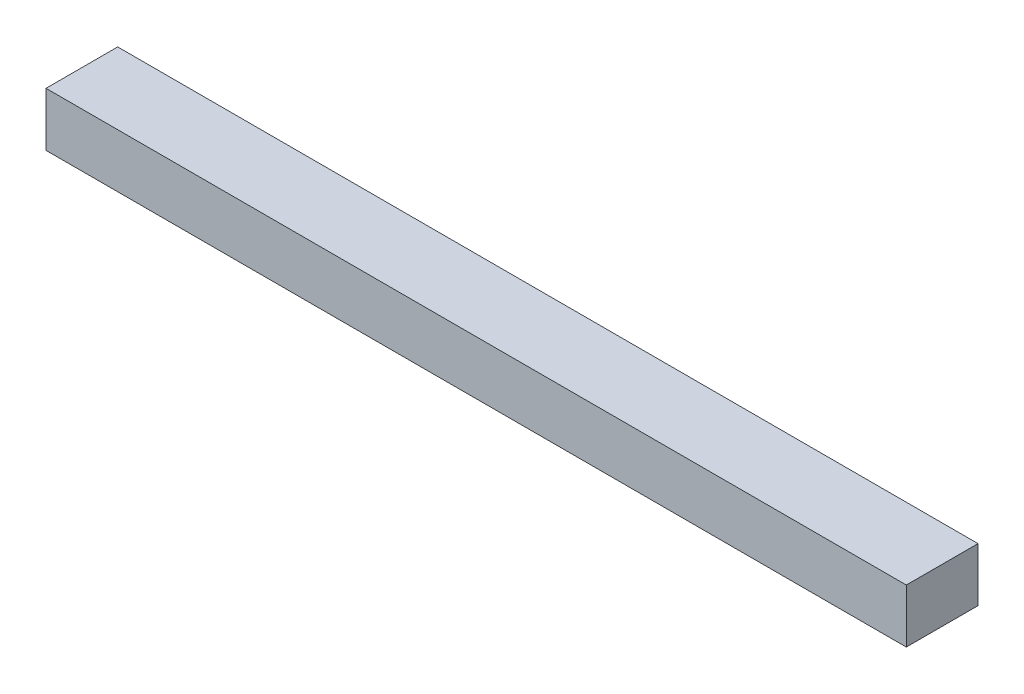
ISO-10303-21;
HEADER;
FILE_DESCRIPTION(('STEP AP214'),'2;1');
FILE_NAME('part.step','',(''),(''),'','','');
FILE_SCHEMA(('AUTOMOTIVE_DESIGN { 1 0 10303 214 1 1 1 1 }'));
ENDSEC;
DATA;
#1=APPLICATION_CONTEXT('core data for automotive mechanical design processes');
#2=APPLICATION_PROTOCOL_DEFINITION('international standard','automotive_design',2000,#1);
#3=PRODUCT_CONTEXT('',#1,'mechanical');
#4=PRODUCT('Part','Part','',(#3));
#5=PRODUCT_RELATED_PRODUCT_CATEGORY('part','',(#4));
#6=PRODUCT_DEFINITION_FORMATION('','',#4);
#7=PRODUCT_DEFINITION_CONTEXT('part definition',#1,'design');
#8=PRODUCT_DEFINITION('design','',#6,#7);
#9=PRODUCT_DEFINITION_SHAPE('','',#8);
#10=(LENGTH_UNIT() NAMED_UNIT(*) SI_UNIT(.MILLI.,.METRE.));
#11=(NAMED_UNIT(*) PLANE_ANGLE_UNIT() SI_UNIT($,.RADIAN.));
#12=(NAMED_UNIT(*) SI_UNIT($,.STERADIAN.) SOLID_ANGLE_UNIT());
#13=UNCERTAINTY_MEASURE_WITH_UNIT(LENGTH_MEASURE(1.E-05),#10,'distance_accuracy_value','');
#14=(GEOMETRIC_REPRESENTATION_CONTEXT(3) GLOBAL_UNCERTAINTY_ASSIGNED_CONTEXT((#13)) GLOBAL_UNIT_ASSIGNED_CONTEXT((#10,
#11,#12)) REPRESENTATION_CONTEXT('',''));
#15=CARTESIAN_POINT('',(0.,0.,0.));
#16=DIRECTION('',(0.,0.,1.));
#17=DIRECTION('',(1.,0.,0.));
#18=AXIS2_PLACEMENT_3D('',#15,#16,#17);
#19=CARTESIAN_POINT('',(-480.,70.,510.));
#20=DIRECTION('',(0.,0.,1.));
#21=DIRECTION('',(1.,0.,0.));
#22=AXIS2_PLACEMENT_3D('',#19,#20,#21);
#23=PLANE('',#22);
#24=DIRECTION('',(0.,1.,0.));
#25=VECTOR('',#24,1.);
#26=CARTESIAN_POINT('',(-480.,70.,510.));
#27=LINE('',#26,#25);
#28=CARTESIAN_POINT('',(-480.,70.,510.));
#29=VERTEX_POINT('',#28);
#30=CARTESIAN_POINT('',(-480.,130.,510.));
#31=VERTEX_POINT('',#30);
#32=EDGE_CURVE('E88',#29,#31,#27,.T.);
#33=ORIENTED_EDGE('',*,*,#32,.F.);
#34=DIRECTION('',(1.,0.,0.));
#35=VECTOR('',#34,1.);
#36=CARTESIAN_POINT('',(-480.,70.,510.));
#37=LINE('',#36,#35);
#38=CARTESIAN_POINT('',(480.,70.,510.));
#39=VERTEX_POINT('',#38);
#40=EDGE_CURVE('E69',#29,#39,#37,.T.);
#41=ORIENTED_EDGE('',*,*,#40,.T.);
#42=DIRECTION('',(0.,1.,0.));
#43=VECTOR('',#42,1.);
#44=CARTESIAN_POINT('',(480.,70.,510.));
#45=LINE('',#44,#43);
#46=CARTESIAN_POINT('',(480.,130.,510.));
#47=VERTEX_POINT('',#46);
#48=EDGE_CURVE('E81',#39,#47,#45,.T.);
#49=ORIENTED_EDGE('',*,*,#48,.T.);
#50=DIRECTION('',(1.,0.,0.));
#51=VECTOR('',#50,1.);
#52=CARTESIAN_POINT('',(-480.,130.,510.));
#53=LINE('',#52,#51);
#54=EDGE_CURVE('E9',#31,#47,#53,.T.);
#55=ORIENTED_EDGE('',*,*,#54,.F.);
#56=EDGE_LOOP('',(#33,#41,#49,#55));
#57=FACE_BOUND('',#56,.T.);
#58=ADVANCED_FACE('F15',(#57),#23,.T.);
#59=CARTESIAN_POINT('',(-480.,70.,430.));
#60=DIRECTION('',(0.,0.,1.));
#61=DIRECTION('',(1.,0.,0.));
#62=AXIS2_PLACEMENT_3D('',#59,#60,#61);
#63=PLANE('',#62);
#64=DIRECTION('',(1.,0.,0.));
#65=VECTOR('',#64,1.);
#66=CARTESIAN_POINT('',(-480.,130.,430.));
#67=LINE('',#66,#65);
#68=CARTESIAN_POINT('',(-480.,130.,430.));
#69=VERTEX_POINT('',#68);
#70=CARTESIAN_POINT('',(480.,130.,430.));
#71=VERTEX_POINT('',#70);
#72=EDGE_CURVE('E24',#69,#71,#67,.T.);
#73=ORIENTED_EDGE('',*,*,#72,.T.);
#74=DIRECTION('',(0.,1.,0.));
#75=VECTOR('',#74,1.);
#76=CARTESIAN_POINT('',(480.,70.,430.));
#77=LINE('',#76,#75);
#78=CARTESIAN_POINT('',(480.,70.,430.));
#79=VERTEX_POINT('',#78);
#80=EDGE_CURVE('E101',#79,#71,#77,.T.);
#81=ORIENTED_EDGE('',*,*,#80,.F.);
#82=DIRECTION('',(1.,0.,0.));
#83=VECTOR('',#82,1.);
#84=CARTESIAN_POINT('',(-480.,70.,430.));
#85=LINE('',#84,#83);
#86=CARTESIAN_POINT('',(-480.,70.,430.));
#87=VERTEX_POINT('',#86);
#88=EDGE_CURVE('E18',#87,#79,#85,.T.);
#89=ORIENTED_EDGE('',*,*,#88,.F.);
#90=DIRECTION('',(0.,1.,0.));
#91=VECTOR('',#90,1.);
#92=CARTESIAN_POINT('',(-480.,70.,430.));
#93=LINE('',#92,#91);
#94=EDGE_CURVE('E87',#87,#69,#93,.T.);
#95=ORIENTED_EDGE('',*,*,#94,.T.);
#96=EDGE_LOOP('',(#73,#81,#89,#95));
#97=FACE_BOUND('',#96,.T.);
#98=ADVANCED_FACE('F116',(#97),#63,.F.);
#99=CARTESIAN_POINT('',(-480.,130.,430.));
#100=DIRECTION('',(0.,1.,0.));
#101=DIRECTION('',(1.,0.,0.));
#102=AXIS2_PLACEMENT_3D('',#99,#100,#101);
#103=PLANE('',#102);
#104=ORIENTED_EDGE('',*,*,#72,.F.);
#105=DIRECTION('',(0.,0.,1.));
#106=VECTOR('',#105,1.);
#107=CARTESIAN_POINT('',(-480.,130.,430.));
#108=LINE('',#107,#106);
#109=EDGE_CURVE('E93',#69,#31,#108,.T.);
#110=ORIENTED_EDGE('',*,*,#109,.T.);
#111=ORIENTED_EDGE('',*,*,#54,.T.);
#112=DIRECTION('',(0.,0.,1.));
#113=VECTOR('',#112,1.);
#114=CARTESIAN_POINT('',(480.,130.,430.));
#115=LINE('',#114,#113);
#116=EDGE_CURVE('E110',#71,#47,#115,.T.);
#117=ORIENTED_EDGE('',*,*,#116,.F.);
#118=EDGE_LOOP('',(#104,#110,#111,#117));
#119=FACE_BOUND('',#118,.T.);
#120=ADVANCED_FACE('F113',(#119),#103,.T.);
#121=CARTESIAN_POINT('',(-480.,70.,430.));
#122=DIRECTION('',(0.,1.,0.));
#123=DIRECTION('',(1.,0.,0.));
#124=AXIS2_PLACEMENT_3D('',#121,#122,#123);
#125=PLANE('',#124);
#126=DIRECTION('',(0.,0.,1.));
#127=VECTOR('',#126,1.);
#128=CARTESIAN_POINT('',(480.,70.,430.));
#129=LINE('',#128,#127);
#130=EDGE_CURVE('E76',#79,#39,#129,.T.);
#131=ORIENTED_EDGE('',*,*,#130,.T.);
#132=ORIENTED_EDGE('',*,*,#40,.F.);
#133=DIRECTION('',(0.,0.,1.));
#134=VECTOR('',#133,1.);
#135=CARTESIAN_POINT('',(-480.,70.,430.));
#136=LINE('',#135,#134);
#137=EDGE_CURVE('E73',#87,#29,#136,.T.);
#138=ORIENTED_EDGE('',*,*,#137,.F.);
#139=ORIENTED_EDGE('',*,*,#88,.T.);
#140=EDGE_LOOP('',(#131,#132,#138,#139));
#141=FACE_BOUND('',#140,.T.);
#142=ADVANCED_FACE('F71',(#141),#125,.F.);
#143=CARTESIAN_POINT('',(480.,70.,430.));
#144=DIRECTION('',(1.,0.,0.));
#145=DIRECTION('',(0.,1.,0.));
#146=AXIS2_PLACEMENT_3D('',#143,#144,#145);
#147=PLANE('',#146);
#148=ORIENTED_EDGE('',*,*,#130,.F.);
#149=ORIENTED_EDGE('',*,*,#80,.T.);
#150=ORIENTED_EDGE('',*,*,#116,.T.);
#151=ORIENTED_EDGE('',*,*,#48,.F.);
#152=EDGE_LOOP('',(#148,#149,#150,#151));
#153=FACE_BOUND('',#152,.T.);
#154=ADVANCED_FACE('F111',(#153),#147,.T.);
#155=CARTESIAN_POINT('',(-480.,70.,430.));
#156=DIRECTION('',(1.,0.,0.));
#157=DIRECTION('',(0.,1.,0.));
#158=AXIS2_PLACEMENT_3D('',#155,#156,#157);
#159=PLANE('',#158);
#160=ORIENTED_EDGE('',*,*,#32,.T.);
#161=ORIENTED_EDGE('',*,*,#109,.F.);
#162=ORIENTED_EDGE('',*,*,#94,.F.);
#163=ORIENTED_EDGE('',*,*,#137,.T.);
#164=EDGE_LOOP('',(#160,#161,#162,#163));
#165=FACE_BOUND('',#164,.T.);
#166=ADVANCED_FACE('F82',(#165),#159,.F.);
#167=CLOSED_SHELL('',(#58,#98,#120,#142,#154,#166));
#168=MANIFOLD_SOLID_BREP('B1',#167);
#169=ADVANCED_BREP_SHAPE_REPRESENTATION('',(#18,#168),#14);
#170=SHAPE_DEFINITION_REPRESENTATION(#9,#169);
ENDSEC;
END-ISO-10303-21;
